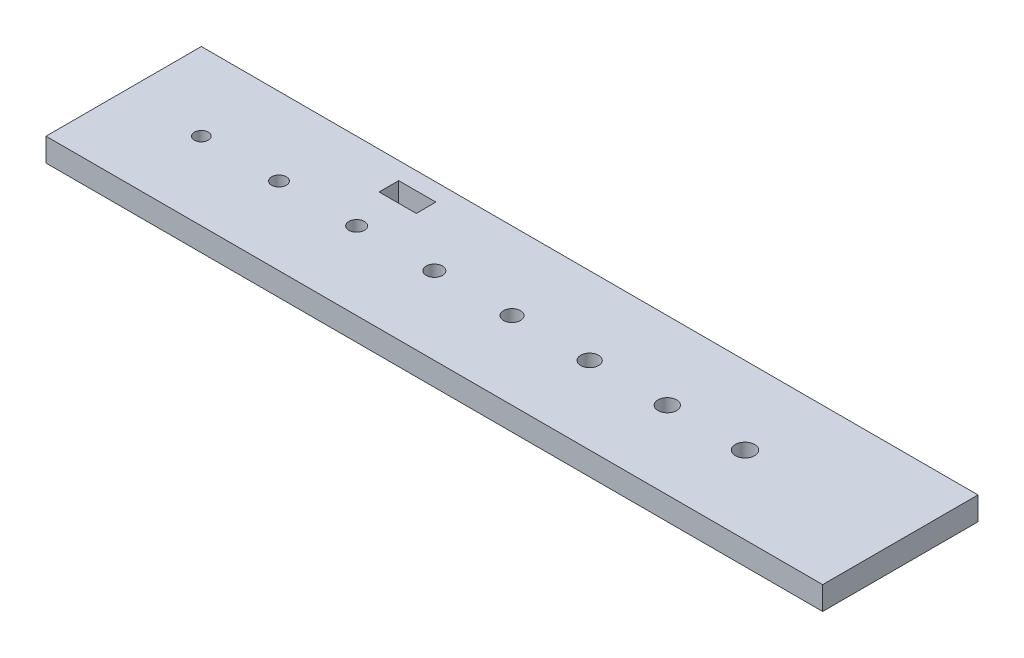
ISO-10303-21;
HEADER;
FILE_DESCRIPTION(('STEP AP214'),'2;1');
FILE_NAME('part.step','',(''),(''),'','','');
FILE_SCHEMA(('AUTOMOTIVE_DESIGN { 1 0 10303 214 1 1 1 1 }'));
ENDSEC;
DATA;
#1=APPLICATION_CONTEXT('core data for automotive mechanical design processes');
#2=APPLICATION_PROTOCOL_DEFINITION('international standard','automotive_design',2000,#1);
#3=PRODUCT_CONTEXT('',#1,'mechanical');
#4=PRODUCT('Part','Part','',(#3));
#5=PRODUCT_RELATED_PRODUCT_CATEGORY('part','',(#4));
#6=PRODUCT_DEFINITION_FORMATION('','',#4);
#7=PRODUCT_DEFINITION_CONTEXT('part definition',#1,'design');
#8=PRODUCT_DEFINITION('design','',#6,#7);
#9=PRODUCT_DEFINITION_SHAPE('','',#8);
#10=(LENGTH_UNIT() NAMED_UNIT(*) SI_UNIT(.MILLI.,.METRE.));
#11=(NAMED_UNIT(*) PLANE_ANGLE_UNIT() SI_UNIT($,.RADIAN.));
#12=(NAMED_UNIT(*) SI_UNIT($,.STERADIAN.) SOLID_ANGLE_UNIT());
#13=UNCERTAINTY_MEASURE_WITH_UNIT(LENGTH_MEASURE(1.E-05),#10,'distance_accuracy_value','');
#14=(GEOMETRIC_REPRESENTATION_CONTEXT(3) GLOBAL_UNCERTAINTY_ASSIGNED_CONTEXT((#13)) GLOBAL_UNIT_ASSIGNED_CONTEXT((#10,
#11,#12)) REPRESENTATION_CONTEXT('',''));
#15=CARTESIAN_POINT('',(0.,0.,0.));
#16=DIRECTION('',(0.,0.,1.));
#17=DIRECTION('',(1.,0.,0.));
#18=AXIS2_PLACEMENT_3D('',#15,#16,#17);
#19=CARTESIAN_POINT('',(0.,3.,0.));
#20=DIRECTION('',(0.,1.,0.));
#21=DIRECTION('',(0.,0.,1.));
#22=AXIS2_PLACEMENT_3D('',#19,#20,#21);
#23=PLANE('',#22);
#24=CARTESIAN_POINT('',(70.,3.,10.));
#25=DIRECTION('',(0.,1.,0.));
#26=DIRECTION('',(0.,0.,1.));
#27=AXIS2_PLACEMENT_3D('',#24,#25,#26);
#28=CIRCLE('',#27,1.2);
#29=CARTESIAN_POINT('',(70.,3.,11.2));
#30=VERTEX_POINT('',#29);
#31=EDGE_CURVE('E282',#30,#30,#28,.T.);
#32=ORIENTED_EDGE('',*,*,#31,.F.);
#33=EDGE_LOOP('',(#32));
#34=FACE_BOUND('',#33,.T.);
#35=CARTESIAN_POINT('',(20.,3.,10.));
#36=DIRECTION('',(0.,1.,0.));
#37=DIRECTION('',(0.,0.,1.));
#38=AXIS2_PLACEMENT_3D('',#35,#36,#37);
#39=CIRCLE('',#38,0.950000000000001);
#40=CARTESIAN_POINT('',(20.,3.,10.95));
#41=VERTEX_POINT('',#40);
#42=EDGE_CURVE('E290',#41,#41,#39,.T.);
#43=ORIENTED_EDGE('',*,*,#42,.F.);
#44=EDGE_LOOP('',(#43));
#45=FACE_BOUND('',#44,.T.);
#46=CARTESIAN_POINT('',(30.,3.,10.));
#47=DIRECTION('',(0.,1.,0.));
#48=DIRECTION('',(0.,0.,1.));
#49=AXIS2_PLACEMENT_3D('',#46,#47,#48);
#50=CIRCLE('',#49,1.);
#51=CARTESIAN_POINT('',(30.,3.,11.));
#52=VERTEX_POINT('',#51);
#53=EDGE_CURVE('E131',#52,#52,#50,.T.);
#54=ORIENTED_EDGE('',*,*,#53,.F.);
#55=EDGE_LOOP('',(#54));
#56=FACE_BOUND('',#55,.T.);
#57=CARTESIAN_POINT('',(50.,3.,10.));
#58=DIRECTION('',(0.,1.,0.));
#59=DIRECTION('',(0.,0.,1.));
#60=AXIS2_PLACEMENT_3D('',#57,#58,#59);
#61=CIRCLE('',#60,1.10000000000001);
#62=CARTESIAN_POINT('',(50.,3.,11.1));
#63=VERTEX_POINT('',#62);
#64=EDGE_CURVE('E315',#63,#63,#61,.T.);
#65=ORIENTED_EDGE('',*,*,#64,.F.);
#66=EDGE_LOOP('',(#65));
#67=FACE_BOUND('',#66,.T.);
#68=CARTESIAN_POINT('',(10.,3.,10.));
#69=DIRECTION('',(0.,1.,0.));
#70=DIRECTION('',(0.,0.,1.));
#71=AXIS2_PLACEMENT_3D('',#68,#69,#70);
#72=CIRCLE('',#71,0.9);
#73=CARTESIAN_POINT('',(10.,3.,10.9));
#74=VERTEX_POINT('',#73);
#75=EDGE_CURVE('E309',#74,#74,#72,.T.);
#76=ORIENTED_EDGE('',*,*,#75,.F.);
#77=EDGE_LOOP('',(#76));
#78=FACE_BOUND('',#77,.T.);
#79=CARTESIAN_POINT('',(60.,3.,10.));
#80=DIRECTION('',(0.,1.,0.));
#81=DIRECTION('',(0.,0.,1.));
#82=AXIS2_PLACEMENT_3D('',#79,#80,#81);
#83=CIRCLE('',#82,1.15);
#84=CARTESIAN_POINT('',(60.,3.,11.15));
#85=VERTEX_POINT('',#84);
#86=EDGE_CURVE('E303',#85,#85,#83,.T.);
#87=ORIENTED_EDGE('',*,*,#86,.F.);
#88=EDGE_LOOP('',(#87));
#89=FACE_BOUND('',#88,.T.);
#90=CARTESIAN_POINT('',(80.,3.,10.));
#91=DIRECTION('',(0.,1.,0.));
#92=DIRECTION('',(0.,0.,1.));
#93=AXIS2_PLACEMENT_3D('',#90,#91,#92);
#94=CIRCLE('',#93,1.25);
#95=CARTESIAN_POINT('',(80.,3.,11.25));
#96=VERTEX_POINT('',#95);
#97=EDGE_CURVE('E297',#96,#96,#94,.T.);
#98=ORIENTED_EDGE('',*,*,#97,.F.);
#99=EDGE_LOOP('',(#98));
#100=FACE_BOUND('',#99,.T.);
#101=CARTESIAN_POINT('',(40.,3.,10.));
#102=DIRECTION('',(0.,1.,0.));
#103=DIRECTION('',(0.,0.,1.));
#104=AXIS2_PLACEMENT_3D('',#101,#102,#103);
#105=CIRCLE('',#104,1.05);
#106=CARTESIAN_POINT('',(40.,3.,11.05));
#107=VERTEX_POINT('',#106);
#108=EDGE_CURVE('E160',#107,#107,#105,.T.);
#109=ORIENTED_EDGE('',*,*,#108,.F.);
#110=EDGE_LOOP('',(#109));
#111=FACE_BOUND('',#110,.T.);
#112=DIRECTION('',(0.,0.,1.));
#113=VECTOR('',#112,1.);
#114=CARTESIAN_POINT('',(0.,3.,0.));
#115=LINE('',#114,#113);
#116=CARTESIAN_POINT('',(0.,3.,0.));
#117=VERTEX_POINT('',#116);
#118=CARTESIAN_POINT('',(0.,3.,20.));
#119=VERTEX_POINT('',#118);
#120=EDGE_CURVE('E165',#117,#119,#115,.T.);
#121=ORIENTED_EDGE('',*,*,#120,.T.);
#122=DIRECTION('',(1.,0.,0.));
#123=VECTOR('',#122,1.);
#124=CARTESIAN_POINT('',(0.,3.,20.));
#125=LINE('',#124,#123);
#126=CARTESIAN_POINT('',(100.,3.,20.));
#127=VERTEX_POINT('',#126);
#128=EDGE_CURVE('E169',#119,#127,#125,.T.);
#129=ORIENTED_EDGE('',*,*,#128,.T.);
#130=DIRECTION('',(0.,0.,-1.));
#131=VECTOR('',#130,1.);
#132=CARTESIAN_POINT('',(100.,3.,0.));
#133=LINE('',#132,#131);
#134=CARTESIAN_POINT('',(100.,3.,0.));
#135=VERTEX_POINT('',#134);
#136=EDGE_CURVE('E173',#127,#135,#133,.T.);
#137=ORIENTED_EDGE('',*,*,#136,.T.);
#138=DIRECTION('',(-1.,0.,0.));
#139=VECTOR('',#138,1.);
#140=CARTESIAN_POINT('',(0.,3.,0.));
#141=LINE('',#140,#139);
#142=EDGE_CURVE('E176',#135,#117,#141,.T.);
#143=ORIENTED_EDGE('',*,*,#142,.T.);
#144=EDGE_LOOP('',(#121,#129,#137,#143));
#145=FACE_BOUND('',#144,.T.);
#146=DIRECTION('',(1.,0.,0.));
#147=VECTOR('',#146,1.);
#148=CARTESIAN_POINT('',(0.,3.,2.25092877574739));
#149=LINE('',#148,#147);
#150=CARTESIAN_POINT('',(27.6629122316575,3.,2.25092877574739));
#151=VERTEX_POINT('',#150);
#152=CARTESIAN_POINT('',(32.4480129083062,3.,2.25092877574739));
#153=VERTEX_POINT('',#152);
#154=EDGE_CURVE('E140',#151,#153,#149,.T.);
#155=ORIENTED_EDGE('',*,*,#154,.T.);
#156=DIRECTION('',(0.,0.,1.));
#157=VECTOR('',#156,1.);
#158=CARTESIAN_POINT('',(32.4480129083062,3.,0.));
#159=LINE('',#158,#157);
#160=CARTESIAN_POINT('',(32.4480129083062,3.,4.77398185979851));
#161=VERTEX_POINT('',#160);
#162=EDGE_CURVE('E54',#153,#161,#159,.T.);
#163=ORIENTED_EDGE('',*,*,#162,.T.);
#164=DIRECTION('',(1.,0.,0.));
#165=VECTOR('',#164,1.);
#166=CARTESIAN_POINT('',(0.,3.,4.77398185979851));
#167=LINE('',#166,#165);
#168=CARTESIAN_POINT('',(27.6629122316575,3.,4.77398185979851));
#169=VERTEX_POINT('',#168);
#170=EDGE_CURVE('E124',#169,#161,#167,.T.);
#171=ORIENTED_EDGE('',*,*,#170,.F.);
#172=DIRECTION('',(0.,0.,1.));
#173=VECTOR('',#172,1.);
#174=CARTESIAN_POINT('',(27.6629122316575,3.,0.));
#175=LINE('',#174,#173);
#176=EDGE_CURVE('E128',#151,#169,#175,.T.);
#177=ORIENTED_EDGE('',*,*,#176,.F.);
#178=EDGE_LOOP('',(#155,#163,#171,#177));
#179=FACE_BOUND('',#178,.T.);
#180=ADVANCED_FACE('F38',(#34,#45,#56,#67,#78,#89,#100,#111,#145,#179),#23,.T.);
#181=CARTESIAN_POINT('',(0.,0.,0.));
#182=DIRECTION('',(0.,1.,0.));
#183=DIRECTION('',(0.,0.,1.));
#184=AXIS2_PLACEMENT_3D('',#181,#182,#183);
#185=PLANE('',#184);
#186=CARTESIAN_POINT('',(70.,0.,10.));
#187=DIRECTION('',(0.,1.,0.));
#188=DIRECTION('',(0.,0.,1.));
#189=AXIS2_PLACEMENT_3D('',#186,#187,#188);
#190=CIRCLE('',#189,1.2);
#191=CARTESIAN_POINT('',(70.,0.,11.2));
#192=VERTEX_POINT('',#191);
#193=EDGE_CURVE('E286',#192,#192,#190,.T.);
#194=ORIENTED_EDGE('',*,*,#193,.T.);
#195=EDGE_LOOP('',(#194));
#196=FACE_BOUND('',#195,.T.);
#197=CARTESIAN_POINT('',(20.,0.,10.));
#198=DIRECTION('',(0.,1.,0.));
#199=DIRECTION('',(0.,0.,1.));
#200=AXIS2_PLACEMENT_3D('',#197,#198,#199);
#201=CIRCLE('',#200,0.950000000000001);
#202=CARTESIAN_POINT('',(20.,0.,10.95));
#203=VERTEX_POINT('',#202);
#204=EDGE_CURVE('E141',#203,#203,#201,.T.);
#205=ORIENTED_EDGE('',*,*,#204,.T.);
#206=EDGE_LOOP('',(#205));
#207=FACE_BOUND('',#206,.T.);
#208=DIRECTION('',(0.,0.,1.));
#209=VECTOR('',#208,1.);
#210=CARTESIAN_POINT('',(0.,0.,0.));
#211=LINE('',#210,#209);
#212=CARTESIAN_POINT('',(0.,0.,0.));
#213=VERTEX_POINT('',#212);
#214=CARTESIAN_POINT('',(0.,0.,20.));
#215=VERTEX_POINT('',#214);
#216=EDGE_CURVE('E159',#213,#215,#211,.T.);
#217=ORIENTED_EDGE('',*,*,#216,.F.);
#218=DIRECTION('',(-1.,0.,0.));
#219=VECTOR('',#218,1.);
#220=CARTESIAN_POINT('',(0.,0.,0.));
#221=LINE('',#220,#219);
#222=CARTESIAN_POINT('',(100.,0.,0.));
#223=VERTEX_POINT('',#222);
#224=EDGE_CURVE('E170',#223,#213,#221,.T.);
#225=ORIENTED_EDGE('',*,*,#224,.F.);
#226=DIRECTION('',(0.,0.,-1.));
#227=VECTOR('',#226,1.);
#228=CARTESIAN_POINT('',(100.,0.,0.));
#229=LINE('',#228,#227);
#230=CARTESIAN_POINT('',(100.,0.,20.));
#231=VERTEX_POINT('',#230);
#232=EDGE_CURVE('E186',#231,#223,#229,.T.);
#233=ORIENTED_EDGE('',*,*,#232,.F.);
#234=DIRECTION('',(1.,0.,0.));
#235=VECTOR('',#234,1.);
#236=CARTESIAN_POINT('',(0.,0.,20.));
#237=LINE('',#236,#235);
#238=EDGE_CURVE('E183',#215,#231,#237,.T.);
#239=ORIENTED_EDGE('',*,*,#238,.F.);
#240=EDGE_LOOP('',(#217,#225,#233,#239));
#241=FACE_BOUND('',#240,.T.);
#242=CARTESIAN_POINT('',(40.,0.,10.));
#243=DIRECTION('',(0.,1.,0.));
#244=DIRECTION('',(0.,0.,1.));
#245=AXIS2_PLACEMENT_3D('',#242,#243,#244);
#246=CIRCLE('',#245,1.05);
#247=CARTESIAN_POINT('',(40.,0.,11.05));
#248=VERTEX_POINT('',#247);
#249=EDGE_CURVE('E155',#248,#248,#246,.T.);
#250=ORIENTED_EDGE('',*,*,#249,.T.);
#251=EDGE_LOOP('',(#250));
#252=FACE_BOUND('',#251,.T.);
#253=CARTESIAN_POINT('',(80.,0.,10.));
#254=DIRECTION('',(0.,1.,0.));
#255=DIRECTION('',(0.,0.,1.));
#256=AXIS2_PLACEMENT_3D('',#253,#254,#255);
#257=CIRCLE('',#256,1.25);
#258=CARTESIAN_POINT('',(80.,0.,11.25));
#259=VERTEX_POINT('',#258);
#260=EDGE_CURVE('E262',#259,#259,#257,.T.);
#261=ORIENTED_EDGE('',*,*,#260,.T.);
#262=EDGE_LOOP('',(#261));
#263=FACE_BOUND('',#262,.T.);
#264=CARTESIAN_POINT('',(60.,0.,10.));
#265=DIRECTION('',(0.,1.,0.));
#266=DIRECTION('',(0.,0.,1.));
#267=AXIS2_PLACEMENT_3D('',#264,#265,#266);
#268=CIRCLE('',#267,1.15);
#269=CARTESIAN_POINT('',(60.,0.,11.15));
#270=VERTEX_POINT('',#269);
#271=EDGE_CURVE('E266',#270,#270,#268,.T.);
#272=ORIENTED_EDGE('',*,*,#271,.T.);
#273=EDGE_LOOP('',(#272));
#274=FACE_BOUND('',#273,.T.);
#275=CARTESIAN_POINT('',(10.,0.,10.));
#276=DIRECTION('',(0.,1.,0.));
#277=DIRECTION('',(0.,0.,1.));
#278=AXIS2_PLACEMENT_3D('',#275,#276,#277);
#279=CIRCLE('',#278,0.9);
#280=CARTESIAN_POINT('',(10.,0.,10.9));
#281=VERTEX_POINT('',#280);
#282=EDGE_CURVE('E270',#281,#281,#279,.T.);
#283=ORIENTED_EDGE('',*,*,#282,.T.);
#284=EDGE_LOOP('',(#283));
#285=FACE_BOUND('',#284,.T.);
#286=CARTESIAN_POINT('',(50.,0.,10.));
#287=DIRECTION('',(0.,1.,0.));
#288=DIRECTION('',(0.,0.,1.));
#289=AXIS2_PLACEMENT_3D('',#286,#287,#288);
#290=CIRCLE('',#289,1.10000000000001);
#291=CARTESIAN_POINT('',(50.,0.,11.1));
#292=VERTEX_POINT('',#291);
#293=EDGE_CURVE('E274',#292,#292,#290,.T.);
#294=ORIENTED_EDGE('',*,*,#293,.T.);
#295=EDGE_LOOP('',(#294));
#296=FACE_BOUND('',#295,.T.);
#297=CARTESIAN_POINT('',(30.,0.,10.));
#298=DIRECTION('',(0.,1.,0.));
#299=DIRECTION('',(0.,0.,1.));
#300=AXIS2_PLACEMENT_3D('',#297,#298,#299);
#301=CIRCLE('',#300,1.);
#302=CARTESIAN_POINT('',(30.,0.,11.));
#303=VERTEX_POINT('',#302);
#304=EDGE_CURVE('E164',#303,#303,#301,.T.);
#305=ORIENTED_EDGE('',*,*,#304,.T.);
#306=EDGE_LOOP('',(#305));
#307=FACE_BOUND('',#306,.T.);
#308=DIRECTION('',(0.,0.,1.));
#309=VECTOR('',#308,1.);
#310=CARTESIAN_POINT('',(32.4480129083062,0.,0.));
#311=LINE('',#310,#309);
#312=CARTESIAN_POINT('',(32.4480129083062,0.,2.25092877574739));
#313=VERTEX_POINT('',#312);
#314=CARTESIAN_POINT('',(32.4480129083062,0.,4.77398185979851));
#315=VERTEX_POINT('',#314);
#316=EDGE_CURVE('E113',#313,#315,#311,.T.);
#317=ORIENTED_EDGE('',*,*,#316,.F.);
#318=DIRECTION('',(1.,0.,0.));
#319=VECTOR('',#318,1.);
#320=CARTESIAN_POINT('',(0.,0.,2.25092877574739));
#321=LINE('',#320,#319);
#322=CARTESIAN_POINT('',(27.6629122316575,0.,2.25092877574739));
#323=VERTEX_POINT('',#322);
#324=EDGE_CURVE('E104',#323,#313,#321,.T.);
#325=ORIENTED_EDGE('',*,*,#324,.F.);
#326=DIRECTION('',(0.,0.,1.));
#327=VECTOR('',#326,1.);
#328=CARTESIAN_POINT('',(27.6629122316575,0.,0.));
#329=LINE('',#328,#327);
#330=CARTESIAN_POINT('',(27.6629122316575,0.,4.77398185979851));
#331=VERTEX_POINT('',#330);
#332=EDGE_CURVE('E62',#323,#331,#329,.T.);
#333=ORIENTED_EDGE('',*,*,#332,.T.);
#334=DIRECTION('',(1.,0.,0.));
#335=VECTOR('',#334,1.);
#336=CARTESIAN_POINT('',(0.,0.,4.77398185979851));
#337=LINE('',#336,#335);
#338=EDGE_CURVE('E118',#331,#315,#337,.T.);
#339=ORIENTED_EDGE('',*,*,#338,.T.);
#340=EDGE_LOOP('',(#317,#325,#333,#339));
#341=FACE_BOUND('',#340,.T.);
#342=ADVANCED_FACE('F121',(#196,#207,#241,#252,#263,#274,#285,#296,#307,#341),#185,.F.);
#343=CARTESIAN_POINT('',(0.,3.,0.));
#344=DIRECTION('',(1.,0.,0.));
#345=DIRECTION('',(0.,0.,-1.));
#346=AXIS2_PLACEMENT_3D('',#343,#344,#345);
#347=PLANE('',#346);
#348=ORIENTED_EDGE('',*,*,#216,.T.);
#349=DIRECTION('',(0.,-1.,0.));
#350=VECTOR('',#349,1.);
#351=CARTESIAN_POINT('',(0.,3.,20.));
#352=LINE('',#351,#350);
#353=EDGE_CURVE('E11',#119,#215,#352,.T.);
#354=ORIENTED_EDGE('',*,*,#353,.F.);
#355=ORIENTED_EDGE('',*,*,#120,.F.);
#356=DIRECTION('',(0.,-1.,0.));
#357=VECTOR('',#356,1.);
#358=CARTESIAN_POINT('',(0.,3.,0.));
#359=LINE('',#358,#357);
#360=EDGE_CURVE('E179',#117,#213,#359,.T.);
#361=ORIENTED_EDGE('',*,*,#360,.T.);
#362=EDGE_LOOP('',(#348,#354,#355,#361));
#363=FACE_BOUND('',#362,.T.);
#364=ADVANCED_FACE('F40',(#363),#347,.F.);
#365=CARTESIAN_POINT('',(0.,3.,20.));
#366=DIRECTION('',(0.,0.,-1.));
#367=DIRECTION('',(-1.,0.,0.));
#368=AXIS2_PLACEMENT_3D('',#365,#366,#367);
#369=PLANE('',#368);
#370=ORIENTED_EDGE('',*,*,#238,.T.);
#371=DIRECTION('',(0.,-1.,0.));
#372=VECTOR('',#371,1.);
#373=CARTESIAN_POINT('',(100.,3.,20.));
#374=LINE('',#373,#372);
#375=EDGE_CURVE('E47',#127,#231,#374,.T.);
#376=ORIENTED_EDGE('',*,*,#375,.F.);
#377=ORIENTED_EDGE('',*,*,#128,.F.);
#378=ORIENTED_EDGE('',*,*,#353,.T.);
#379=EDGE_LOOP('',(#370,#376,#377,#378));
#380=FACE_BOUND('',#379,.T.);
#381=ADVANCED_FACE('F219',(#380),#369,.F.);
#382=CARTESIAN_POINT('',(100.,3.,0.));
#383=DIRECTION('',(-1.,0.,0.));
#384=DIRECTION('',(0.,0.,1.));
#385=AXIS2_PLACEMENT_3D('',#382,#383,#384);
#386=PLANE('',#385);
#387=ORIENTED_EDGE('',*,*,#232,.T.);
#388=DIRECTION('',(0.,-1.,0.));
#389=VECTOR('',#388,1.);
#390=CARTESIAN_POINT('',(100.,3.,0.));
#391=LINE('',#390,#389);
#392=EDGE_CURVE('E194',#135,#223,#391,.T.);
#393=ORIENTED_EDGE('',*,*,#392,.F.);
#394=ORIENTED_EDGE('',*,*,#136,.F.);
#395=ORIENTED_EDGE('',*,*,#375,.T.);
#396=EDGE_LOOP('',(#387,#393,#394,#395));
#397=FACE_BOUND('',#396,.T.);
#398=ADVANCED_FACE('F203',(#397),#386,.F.);
#399=CARTESIAN_POINT('',(0.,3.,0.));
#400=DIRECTION('',(0.,0.,1.));
#401=DIRECTION('',(1.,0.,0.));
#402=AXIS2_PLACEMENT_3D('',#399,#400,#401);
#403=PLANE('',#402);
#404=ORIENTED_EDGE('',*,*,#224,.T.);
#405=ORIENTED_EDGE('',*,*,#360,.F.);
#406=ORIENTED_EDGE('',*,*,#142,.F.);
#407=ORIENTED_EDGE('',*,*,#392,.T.);
#408=EDGE_LOOP('',(#404,#405,#406,#407));
#409=FACE_BOUND('',#408,.T.);
#410=ADVANCED_FACE('F212',(#409),#403,.F.);
#411=CARTESIAN_POINT('',(40.,0.,10.));
#412=DIRECTION('',(0.,1.,0.));
#413=DIRECTION('',(0.,0.,1.));
#414=AXIS2_PLACEMENT_3D('',#411,#412,#413);
#415=CYLINDRICAL_SURFACE('',#414,1.05);
#416=ORIENTED_EDGE('',*,*,#249,.F.);
#417=EDGE_LOOP('',(#416));
#418=FACE_BOUND('',#417,.T.);
#419=ORIENTED_EDGE('',*,*,#108,.T.);
#420=EDGE_LOOP('',(#419));
#421=FACE_BOUND('',#420,.T.);
#422=ADVANCED_FACE('F238',(#418,#421),#415,.F.);
#423=CARTESIAN_POINT('',(80.,0.,10.));
#424=DIRECTION('',(0.,1.,0.));
#425=DIRECTION('',(0.,0.,1.));
#426=AXIS2_PLACEMENT_3D('',#423,#424,#425);
#427=CYLINDRICAL_SURFACE('',#426,1.25);
#428=ORIENTED_EDGE('',*,*,#260,.F.);
#429=EDGE_LOOP('',(#428));
#430=FACE_BOUND('',#429,.T.);
#431=ORIENTED_EDGE('',*,*,#97,.T.);
#432=EDGE_LOOP('',(#431));
#433=FACE_BOUND('',#432,.T.);
#434=ADVANCED_FACE('F245',(#430,#433),#427,.F.);
#435=CARTESIAN_POINT('',(60.,0.,10.));
#436=DIRECTION('',(0.,1.,0.));
#437=DIRECTION('',(0.,0.,1.));
#438=AXIS2_PLACEMENT_3D('',#435,#436,#437);
#439=CYLINDRICAL_SURFACE('',#438,1.15);
#440=ORIENTED_EDGE('',*,*,#271,.F.);
#441=EDGE_LOOP('',(#440));
#442=FACE_BOUND('',#441,.T.);
#443=ORIENTED_EDGE('',*,*,#86,.T.);
#444=EDGE_LOOP('',(#443));
#445=FACE_BOUND('',#444,.T.);
#446=ADVANCED_FACE('F251',(#442,#445),#439,.F.);
#447=CARTESIAN_POINT('',(10.,0.,10.));
#448=DIRECTION('',(0.,1.,0.));
#449=DIRECTION('',(0.,0.,1.));
#450=AXIS2_PLACEMENT_3D('',#447,#448,#449);
#451=CYLINDRICAL_SURFACE('',#450,0.9);
#452=ORIENTED_EDGE('',*,*,#282,.F.);
#453=EDGE_LOOP('',(#452));
#454=FACE_BOUND('',#453,.T.);
#455=ORIENTED_EDGE('',*,*,#75,.T.);
#456=EDGE_LOOP('',(#455));
#457=FACE_BOUND('',#456,.T.);
#458=ADVANCED_FACE('F333',(#454,#457),#451,.F.);
#459=CARTESIAN_POINT('',(50.,0.,10.));
#460=DIRECTION('',(0.,1.,0.));
#461=DIRECTION('',(0.,0.,1.));
#462=AXIS2_PLACEMENT_3D('',#459,#460,#461);
#463=CYLINDRICAL_SURFACE('',#462,1.10000000000001);
#464=ORIENTED_EDGE('',*,*,#293,.F.);
#465=EDGE_LOOP('',(#464));
#466=FACE_BOUND('',#465,.T.);
#467=ORIENTED_EDGE('',*,*,#64,.T.);
#468=EDGE_LOOP('',(#467));
#469=FACE_BOUND('',#468,.T.);
#470=ADVANCED_FACE('F322',(#466,#469),#463,.F.);
#471=CARTESIAN_POINT('',(30.,0.,10.));
#472=DIRECTION('',(0.,1.,0.));
#473=DIRECTION('',(0.,0.,1.));
#474=AXIS2_PLACEMENT_3D('',#471,#472,#473);
#475=CYLINDRICAL_SURFACE('',#474,1.);
#476=ORIENTED_EDGE('',*,*,#304,.F.);
#477=EDGE_LOOP('',(#476));
#478=FACE_BOUND('',#477,.T.);
#479=ORIENTED_EDGE('',*,*,#53,.T.);
#480=EDGE_LOOP('',(#479));
#481=FACE_BOUND('',#480,.T.);
#482=ADVANCED_FACE('F351',(#478,#481),#475,.F.);
#483=CARTESIAN_POINT('',(32.4480129083062,0.,0.));
#484=DIRECTION('',(-1.,0.,0.));
#485=DIRECTION('',(0.,0.,1.));
#486=AXIS2_PLACEMENT_3D('',#483,#484,#485);
#487=PLANE('',#486);
#488=ORIENTED_EDGE('',*,*,#162,.F.);
#489=DIRECTION('',(0.,1.,0.));
#490=VECTOR('',#489,1.);
#491=CARTESIAN_POINT('',(32.4480129083062,0.,2.25092877574739));
#492=LINE('',#491,#490);
#493=EDGE_CURVE('E107',#313,#153,#492,.T.);
#494=ORIENTED_EDGE('',*,*,#493,.F.);
#495=ORIENTED_EDGE('',*,*,#316,.T.);
#496=DIRECTION('',(0.,1.,0.));
#497=VECTOR('',#496,1.);
#498=CARTESIAN_POINT('',(32.4480129083062,0.,4.77398185979851));
#499=LINE('',#498,#497);
#500=EDGE_CURVE('E147',#315,#161,#499,.T.);
#501=ORIENTED_EDGE('',*,*,#500,.T.);
#502=EDGE_LOOP('',(#488,#494,#495,#501));
#503=FACE_BOUND('',#502,.T.);
#504=ADVANCED_FACE('F115',(#503),#487,.T.);
#505=CARTESIAN_POINT('',(0.,0.,4.77398185979851));
#506=DIRECTION('',(0.,0.,1.));
#507=DIRECTION('',(1.,0.,0.));
#508=AXIS2_PLACEMENT_3D('',#505,#506,#507);
#509=PLANE('',#508);
#510=ORIENTED_EDGE('',*,*,#170,.T.);
#511=ORIENTED_EDGE('',*,*,#500,.F.);
#512=ORIENTED_EDGE('',*,*,#338,.F.);
#513=DIRECTION('',(0.,1.,0.));
#514=VECTOR('',#513,1.);
#515=CARTESIAN_POINT('',(27.6629122316575,0.,4.77398185979851));
#516=LINE('',#515,#514);
#517=EDGE_CURVE('E150',#331,#169,#516,.T.);
#518=ORIENTED_EDGE('',*,*,#517,.T.);
#519=EDGE_LOOP('',(#510,#511,#512,#518));
#520=FACE_BOUND('',#519,.T.);
#521=ADVANCED_FACE('F354',(#520),#509,.F.);
#522=CARTESIAN_POINT('',(27.6629122316575,0.,0.));
#523=DIRECTION('',(-1.,0.,0.));
#524=DIRECTION('',(0.,0.,1.));
#525=AXIS2_PLACEMENT_3D('',#522,#523,#524);
#526=PLANE('',#525);
#527=ORIENTED_EDGE('',*,*,#176,.T.);
#528=ORIENTED_EDGE('',*,*,#517,.F.);
#529=ORIENTED_EDGE('',*,*,#332,.F.);
#530=DIRECTION('',(0.,1.,0.));
#531=VECTOR('',#530,1.);
#532=CARTESIAN_POINT('',(27.6629122316575,0.,2.25092877574739));
#533=LINE('',#532,#531);
#534=EDGE_CURVE('E109',#323,#151,#533,.T.);
#535=ORIENTED_EDGE('',*,*,#534,.T.);
#536=EDGE_LOOP('',(#527,#528,#529,#535));
#537=FACE_BOUND('',#536,.T.);
#538=ADVANCED_FACE('F357',(#537),#526,.F.);
#539=CARTESIAN_POINT('',(0.,0.,2.25092877574739));
#540=DIRECTION('',(0.,0.,1.));
#541=DIRECTION('',(1.,0.,0.));
#542=AXIS2_PLACEMENT_3D('',#539,#540,#541);
#543=PLANE('',#542);
#544=ORIENTED_EDGE('',*,*,#154,.F.);
#545=ORIENTED_EDGE('',*,*,#534,.F.);
#546=ORIENTED_EDGE('',*,*,#324,.T.);
#547=ORIENTED_EDGE('',*,*,#493,.T.);
#548=EDGE_LOOP('',(#544,#545,#546,#547));
#549=FACE_BOUND('',#548,.T.);
#550=ADVANCED_FACE('F106',(#549),#543,.T.);
#551=CARTESIAN_POINT('',(20.,0.,10.));
#552=DIRECTION('',(0.,1.,0.));
#553=DIRECTION('',(0.,0.,1.));
#554=AXIS2_PLACEMENT_3D('',#551,#552,#553);
#555=CYLINDRICAL_SURFACE('',#554,0.950000000000001);
#556=ORIENTED_EDGE('',*,*,#204,.F.);
#557=EDGE_LOOP('',(#556));
#558=FACE_BOUND('',#557,.T.);
#559=ORIENTED_EDGE('',*,*,#42,.T.);
#560=EDGE_LOOP('',(#559));
#561=FACE_BOUND('',#560,.T.);
#562=ADVANCED_FACE('F343',(#558,#561),#555,.F.);
#563=CARTESIAN_POINT('',(70.,0.,10.));
#564=DIRECTION('',(0.,1.,0.));
#565=DIRECTION('',(0.,0.,1.));
#566=AXIS2_PLACEMENT_3D('',#563,#564,#565);
#567=CYLINDRICAL_SURFACE('',#566,1.2);
#568=ORIENTED_EDGE('',*,*,#193,.F.);
#569=EDGE_LOOP('',(#568));
#570=FACE_BOUND('',#569,.T.);
#571=ORIENTED_EDGE('',*,*,#31,.T.);
#572=EDGE_LOOP('',(#571));
#573=FACE_BOUND('',#572,.T.);
#574=ADVANCED_FACE('F346',(#570,#573),#567,.F.);
#575=CLOSED_SHELL('',(#180,#342,#364,#381,#398,#410,#422,#434,#446,#458,#470,#482,#504,#521,
#538,#550,#562,#574));
#576=MANIFOLD_SOLID_BREP('B2',#575);
#577=ADVANCED_BREP_SHAPE_REPRESENTATION('',(#18,#576),#14);
#578=SHAPE_DEFINITION_REPRESENTATION(#9,#577);
ENDSEC;
END-ISO-10303-21;
